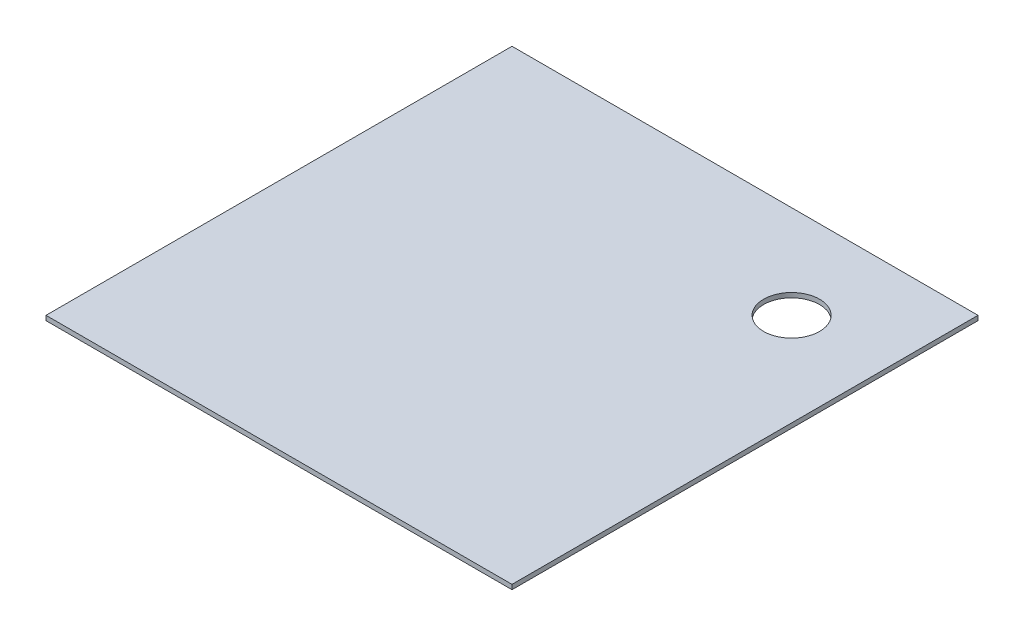
ISO-10303-21;
HEADER;
FILE_DESCRIPTION(('STEP AP214'),'2;1');
FILE_NAME('part.step','',(''),(''),'','','');
FILE_SCHEMA(('AUTOMOTIVE_DESIGN { 1 0 10303 214 1 1 1 1 }'));
ENDSEC;
DATA;
#1=APPLICATION_CONTEXT('core data for automotive mechanical design processes');
#2=APPLICATION_PROTOCOL_DEFINITION('international standard','automotive_design',2000,#1);
#3=PRODUCT_CONTEXT('',#1,'mechanical');
#4=PRODUCT('Part','Part','',(#3));
#5=PRODUCT_RELATED_PRODUCT_CATEGORY('part','',(#4));
#6=PRODUCT_DEFINITION_FORMATION('','',#4);
#7=PRODUCT_DEFINITION_CONTEXT('part definition',#1,'design');
#8=PRODUCT_DEFINITION('design','',#6,#7);
#9=PRODUCT_DEFINITION_SHAPE('','',#8);
#10=(LENGTH_UNIT() NAMED_UNIT(*) SI_UNIT(.MILLI.,.METRE.));
#11=(NAMED_UNIT(*) PLANE_ANGLE_UNIT() SI_UNIT($,.RADIAN.));
#12=(NAMED_UNIT(*) SI_UNIT($,.STERADIAN.) SOLID_ANGLE_UNIT());
#13=UNCERTAINTY_MEASURE_WITH_UNIT(LENGTH_MEASURE(1.E-05),#10,'distance_accuracy_value','');
#14=(GEOMETRIC_REPRESENTATION_CONTEXT(3) GLOBAL_UNCERTAINTY_ASSIGNED_CONTEXT((#13)) GLOBAL_UNIT_ASSIGNED_CONTEXT((#10,
#11,#12)) REPRESENTATION_CONTEXT('',''));
#15=CARTESIAN_POINT('',(0.,0.,0.));
#16=DIRECTION('',(0.,0.,1.));
#17=DIRECTION('',(1.,0.,0.));
#18=AXIS2_PLACEMENT_3D('',#15,#16,#17);
#19=CARTESIAN_POINT('',(0.,0.25,0.));
#20=DIRECTION('',(0.,-1.,0.));
#21=DIRECTION('',(0.,0.,-1.));
#22=AXIS2_PLACEMENT_3D('',#19,#20,#21);
#23=PLANE('',#22);
#24=DIRECTION('',(0.,0.,-1.));
#25=VECTOR('',#24,1.);
#26=CARTESIAN_POINT('',(25.,0.25,25.));
#27=LINE('',#26,#25);
#28=CARTESIAN_POINT('',(25.,0.25,25.));
#29=VERTEX_POINT('',#28);
#30=CARTESIAN_POINT('',(25.,0.25,-25.));
#31=VERTEX_POINT('',#30);
#32=EDGE_CURVE('E92',#29,#31,#27,.T.);
#33=ORIENTED_EDGE('',*,*,#32,.T.);
#34=DIRECTION('',(-1.,0.,0.));
#35=VECTOR('',#34,1.);
#36=CARTESIAN_POINT('',(-25.,0.25,-25.));
#37=LINE('',#36,#35);
#38=CARTESIAN_POINT('',(-25.,0.25,-25.));
#39=VERTEX_POINT('',#38);
#40=EDGE_CURVE('E87',#31,#39,#37,.T.);
#41=ORIENTED_EDGE('',*,*,#40,.T.);
#42=DIRECTION('',(0.,0.,1.));
#43=VECTOR('',#42,1.);
#44=CARTESIAN_POINT('',(-25.,0.25,25.));
#45=LINE('',#44,#43);
#46=CARTESIAN_POINT('',(-25.,0.25,25.));
#47=VERTEX_POINT('',#46);
#48=EDGE_CURVE('E90',#39,#47,#45,.T.);
#49=ORIENTED_EDGE('',*,*,#48,.T.);
#50=DIRECTION('',(1.,0.,0.));
#51=VECTOR('',#50,1.);
#52=CARTESIAN_POINT('',(-25.,0.25,25.));
#53=LINE('',#52,#51);
#54=EDGE_CURVE('E57',#47,#29,#53,.T.);
#55=ORIENTED_EDGE('',*,*,#54,.T.);
#56=EDGE_LOOP('',(#33,#41,#49,#55));
#57=FACE_BOUND('',#56,.T.);
#58=CARTESIAN_POINT('',(15.,0.25,-15.));
#59=DIRECTION('',(0.,1.,0.));
#60=DIRECTION('',(0.,0.,1.));
#61=AXIS2_PLACEMENT_3D('',#58,#59,#60);
#62=CIRCLE('',#61,3.);
#63=CARTESIAN_POINT('',(15.,0.25,-12.));
#64=VERTEX_POINT('',#63);
#65=EDGE_CURVE('E112',#64,#64,#62,.T.);
#66=ORIENTED_EDGE('',*,*,#65,.F.);
#67=EDGE_LOOP('',(#66));
#68=FACE_BOUND('',#67,.T.);
#69=ADVANCED_FACE('F39',(#57,#68),#23,.F.);
#70=CARTESIAN_POINT('',(0.,-0.25,0.));
#71=DIRECTION('',(0.,-1.,0.));
#72=DIRECTION('',(0.,0.,-1.));
#73=AXIS2_PLACEMENT_3D('',#70,#71,#72);
#74=PLANE('',#73);
#75=DIRECTION('',(0.,0.,-1.));
#76=VECTOR('',#75,1.);
#77=CARTESIAN_POINT('',(25.,-0.25,25.));
#78=LINE('',#77,#76);
#79=CARTESIAN_POINT('',(25.,-0.25,25.));
#80=VERTEX_POINT('',#79);
#81=CARTESIAN_POINT('',(25.,-0.25,-25.));
#82=VERTEX_POINT('',#81);
#83=EDGE_CURVE('E108',#80,#82,#78,.T.);
#84=ORIENTED_EDGE('',*,*,#83,.F.);
#85=DIRECTION('',(1.,0.,0.));
#86=VECTOR('',#85,1.);
#87=CARTESIAN_POINT('',(-25.,-0.25,25.));
#88=LINE('',#87,#86);
#89=CARTESIAN_POINT('',(-25.,-0.25,25.));
#90=VERTEX_POINT('',#89);
#91=EDGE_CURVE('E80',#90,#80,#88,.T.);
#92=ORIENTED_EDGE('',*,*,#91,.F.);
#93=DIRECTION('',(0.,0.,1.));
#94=VECTOR('',#93,1.);
#95=CARTESIAN_POINT('',(-25.,-0.25,25.));
#96=LINE('',#95,#94);
#97=CARTESIAN_POINT('',(-25.,-0.25,-25.));
#98=VERTEX_POINT('',#97);
#99=EDGE_CURVE('E74',#98,#90,#96,.T.);
#100=ORIENTED_EDGE('',*,*,#99,.F.);
#101=DIRECTION('',(-1.,0.,0.));
#102=VECTOR('',#101,1.);
#103=CARTESIAN_POINT('',(-25.,-0.25,-25.));
#104=LINE('',#103,#102);
#105=EDGE_CURVE('E97',#82,#98,#104,.T.);
#106=ORIENTED_EDGE('',*,*,#105,.F.);
#107=EDGE_LOOP('',(#84,#92,#100,#106));
#108=FACE_BOUND('',#107,.T.);
#109=CARTESIAN_POINT('',(15.,-0.25,-15.));
#110=DIRECTION('',(0.,1.,0.));
#111=DIRECTION('',(0.,0.,1.));
#112=AXIS2_PLACEMENT_3D('',#109,#110,#111);
#113=CIRCLE('',#112,3.);
#114=CARTESIAN_POINT('',(15.,-0.25,-12.));
#115=VERTEX_POINT('',#114);
#116=EDGE_CURVE('E130',#115,#115,#113,.T.);
#117=ORIENTED_EDGE('',*,*,#116,.T.);
#118=EDGE_LOOP('',(#117));
#119=FACE_BOUND('',#118,.T.);
#120=ADVANCED_FACE('F125',(#108,#119),#74,.T.);
#121=CARTESIAN_POINT('',(25.,0.25,25.));
#122=DIRECTION('',(-1.,0.,0.));
#123=DIRECTION('',(0.,0.,1.));
#124=AXIS2_PLACEMENT_3D('',#121,#122,#123);
#125=PLANE('',#124);
#126=ORIENTED_EDGE('',*,*,#83,.T.);
#127=DIRECTION('',(0.,-1.,0.));
#128=VECTOR('',#127,1.);
#129=CARTESIAN_POINT('',(25.,0.25,-25.));
#130=LINE('',#129,#128);
#131=EDGE_CURVE('E11',#31,#82,#130,.T.);
#132=ORIENTED_EDGE('',*,*,#131,.F.);
#133=ORIENTED_EDGE('',*,*,#32,.F.);
#134=DIRECTION('',(0.,-1.,0.));
#135=VECTOR('',#134,1.);
#136=CARTESIAN_POINT('',(25.,0.25,25.));
#137=LINE('',#136,#135);
#138=EDGE_CURVE('E104',#29,#80,#137,.T.);
#139=ORIENTED_EDGE('',*,*,#138,.T.);
#140=EDGE_LOOP('',(#126,#132,#133,#139));
#141=FACE_BOUND('',#140,.T.);
#142=ADVANCED_FACE('F41',(#141),#125,.F.);
#143=CARTESIAN_POINT('',(-25.,0.25,-25.));
#144=DIRECTION('',(0.,0.,1.));
#145=DIRECTION('',(1.,0.,0.));
#146=AXIS2_PLACEMENT_3D('',#143,#144,#145);
#147=PLANE('',#146);
#148=ORIENTED_EDGE('',*,*,#105,.T.);
#149=DIRECTION('',(0.,-1.,0.));
#150=VECTOR('',#149,1.);
#151=CARTESIAN_POINT('',(-25.,0.25,-25.));
#152=LINE('',#151,#150);
#153=EDGE_CURVE('E49',#39,#98,#152,.T.);
#154=ORIENTED_EDGE('',*,*,#153,.F.);
#155=ORIENTED_EDGE('',*,*,#40,.F.);
#156=ORIENTED_EDGE('',*,*,#131,.T.);
#157=EDGE_LOOP('',(#148,#154,#155,#156));
#158=FACE_BOUND('',#157,.T.);
#159=ADVANCED_FACE('F96',(#158),#147,.F.);
#160=CARTESIAN_POINT('',(-25.,0.25,25.));
#161=DIRECTION('',(1.,0.,0.));
#162=DIRECTION('',(0.,0.,-1.));
#163=AXIS2_PLACEMENT_3D('',#160,#161,#162);
#164=PLANE('',#163);
#165=ORIENTED_EDGE('',*,*,#99,.T.);
#166=DIRECTION('',(0.,-1.,0.));
#167=VECTOR('',#166,1.);
#168=CARTESIAN_POINT('',(-25.,0.25,25.));
#169=LINE('',#168,#167);
#170=EDGE_CURVE('E99',#47,#90,#169,.T.);
#171=ORIENTED_EDGE('',*,*,#170,.F.);
#172=ORIENTED_EDGE('',*,*,#48,.F.);
#173=ORIENTED_EDGE('',*,*,#153,.T.);
#174=EDGE_LOOP('',(#165,#171,#172,#173));
#175=FACE_BOUND('',#174,.T.);
#176=ADVANCED_FACE('F100',(#175),#164,.F.);
#177=CARTESIAN_POINT('',(-25.,0.25,25.));
#178=DIRECTION('',(0.,0.,-1.));
#179=DIRECTION('',(-1.,0.,0.));
#180=AXIS2_PLACEMENT_3D('',#177,#178,#179);
#181=PLANE('',#180);
#182=ORIENTED_EDGE('',*,*,#91,.T.);
#183=ORIENTED_EDGE('',*,*,#138,.F.);
#184=ORIENTED_EDGE('',*,*,#54,.F.);
#185=ORIENTED_EDGE('',*,*,#170,.T.);
#186=EDGE_LOOP('',(#182,#183,#184,#185));
#187=FACE_BOUND('',#186,.T.);
#188=ADVANCED_FACE('F122',(#187),#181,.F.);
#189=CARTESIAN_POINT('',(15.,0.25,-15.));
#190=DIRECTION('',(0.,-1.,0.));
#191=DIRECTION('',(0.,0.,-1.));
#192=AXIS2_PLACEMENT_3D('',#189,#190,#191);
#193=CYLINDRICAL_SURFACE('',#192,3.);
#194=ORIENTED_EDGE('',*,*,#65,.T.);
#195=EDGE_LOOP('',(#194));
#196=FACE_BOUND('',#195,.T.);
#197=ORIENTED_EDGE('',*,*,#116,.F.);
#198=EDGE_LOOP('',(#197));
#199=FACE_BOUND('',#198,.T.);
#200=ADVANCED_FACE('F138',(#196,#199),#193,.F.);
#201=CLOSED_SHELL('',(#69,#120,#142,#159,#176,#188,#200));
#202=MANIFOLD_SOLID_BREP('B2',#201);
#203=ADVANCED_BREP_SHAPE_REPRESENTATION('',(#18,#202),#14);
#204=SHAPE_DEFINITION_REPRESENTATION(#9,#203);
ENDSEC;
END-ISO-10303-21;
